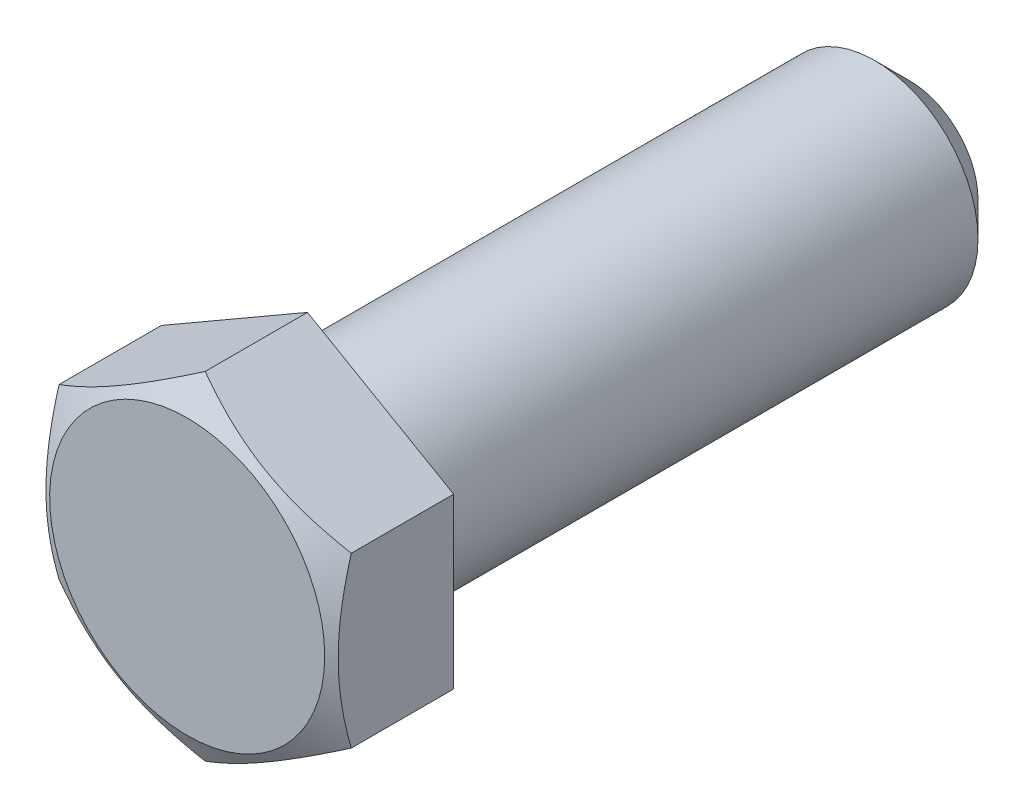
ISO-10303-21;
HEADER;
FILE_DESCRIPTION(('STEP AP214'),'2;1');
FILE_NAME('part.step','',(''),(''),'','','');
FILE_SCHEMA(('AUTOMOTIVE_DESIGN { 1 0 10303 214 1 1 1 1 }'));
ENDSEC;
DATA;
#1=APPLICATION_CONTEXT('core data for automotive mechanical design processes');
#2=APPLICATION_PROTOCOL_DEFINITION('international standard','automotive_design',2000,#1);
#3=PRODUCT_CONTEXT('',#1,'mechanical');
#4=PRODUCT('Part','Part','',(#3));
#5=PRODUCT_RELATED_PRODUCT_CATEGORY('part','',(#4));
#6=PRODUCT_DEFINITION_FORMATION('','',#4);
#7=PRODUCT_DEFINITION_CONTEXT('part definition',#1,'design');
#8=PRODUCT_DEFINITION('design','',#6,#7);
#9=PRODUCT_DEFINITION_SHAPE('','',#8);
#10=(LENGTH_UNIT() NAMED_UNIT(*) SI_UNIT(.MILLI.,.METRE.));
#11=(NAMED_UNIT(*) PLANE_ANGLE_UNIT() SI_UNIT($,.RADIAN.));
#12=(NAMED_UNIT(*) SI_UNIT($,.STERADIAN.) SOLID_ANGLE_UNIT());
#13=UNCERTAINTY_MEASURE_WITH_UNIT(LENGTH_MEASURE(1.E-05),#10,'distance_accuracy_value','');
#14=(GEOMETRIC_REPRESENTATION_CONTEXT(3) GLOBAL_UNCERTAINTY_ASSIGNED_CONTEXT((#13)) GLOBAL_UNIT_ASSIGNED_CONTEXT((#10,
#11,#12)) REPRESENTATION_CONTEXT('',''));
#15=CARTESIAN_POINT('',(0.,0.,0.));
#16=DIRECTION('',(0.,0.,1.));
#17=DIRECTION('',(1.,0.,0.));
#18=AXIS2_PLACEMENT_3D('',#15,#16,#17);
#19=CARTESIAN_POINT('',(0.,0.,-7.));
#20=DIRECTION('',(0.,0.,-1.));
#21=DIRECTION('',(-1.,0.,0.));
#22=AXIS2_PLACEMENT_3D('',#19,#20,#21);
#23=PLANE('',#22);
#24=CARTESIAN_POINT('',(0.,0.,-7.));
#25=DIRECTION('',(0.,0.,-1.));
#26=DIRECTION('',(-1.,0.,0.));
#27=AXIS2_PLACEMENT_3D('',#24,#25,#26);
#28=CIRCLE('',#27,6.6);
#29=CARTESIAN_POINT('',(-6.60000000000002,0.,-7.));
#30=VERTEX_POINT('',#29);
#31=EDGE_CURVE('E189',#30,#30,#28,.F.);
#32=ORIENTED_EDGE('',*,*,#31,.T.);
#33=EDGE_LOOP('',(#32));
#34=FACE_BOUND('',#33,.T.);
#35=DIRECTION('',(-0.866025403784439,-0.499999999999999,0.));
#36=VECTOR('',#35,1.);
#37=CARTESIAN_POINT('',(0.,9.81495457622369,-7.00000000000002));
#38=LINE('',#37,#36);
#39=CARTESIAN_POINT('',(0.,9.81495457622369,-7.00000000000002));
#40=VERTEX_POINT('',#39);
#41=CARTESIAN_POINT('',(-8.50000000000006,4.90747728811186,-7.00000000000001));
#42=VERTEX_POINT('',#41);
#43=EDGE_CURVE('E146',#40,#42,#38,.T.);
#44=ORIENTED_EDGE('',*,*,#43,.F.);
#45=DIRECTION('',(-0.866025403784439,0.5,0.));
#46=VECTOR('',#45,1.);
#47=CARTESIAN_POINT('',(8.49999999999997,4.9074772881118,-7.00000000000001));
#48=LINE('',#47,#46);
#49=CARTESIAN_POINT('',(8.49999999999997,4.9074772881118,-7.00000000000001));
#50=VERTEX_POINT('',#49);
#51=EDGE_CURVE('E87',#50,#40,#48,.T.);
#52=ORIENTED_EDGE('',*,*,#51,.F.);
#53=DIRECTION('',(0.,1.,0.));
#54=VECTOR('',#53,1.);
#55=CARTESIAN_POINT('',(8.50000000000002,-4.90747728811184,-7.));
#56=LINE('',#55,#54);
#57=CARTESIAN_POINT('',(8.50000000000002,-4.90747728811184,-7.));
#58=VERTEX_POINT('',#57);
#59=EDGE_CURVE('E155',#58,#50,#56,.T.);
#60=ORIENTED_EDGE('',*,*,#59,.F.);
#61=DIRECTION('',(0.866025403784439,0.499999999999999,0.));
#62=VECTOR('',#61,1.);
#63=CARTESIAN_POINT('',(0.,-9.81495457622357,-7.00000000000003));
#64=LINE('',#63,#62);
#65=CARTESIAN_POINT('',(0.,-9.81495457622357,-7.00000000000003));
#66=VERTEX_POINT('',#65);
#67=EDGE_CURVE('E150',#66,#58,#64,.T.);
#68=ORIENTED_EDGE('',*,*,#67,.F.);
#69=DIRECTION('',(0.866025403784439,-0.5,0.));
#70=VECTOR('',#69,1.);
#71=CARTESIAN_POINT('',(-8.50000000000004,-4.90747728811183,-7.));
#72=LINE('',#71,#70);
#73=CARTESIAN_POINT('',(-8.50000000000004,-4.90747728811183,-7.));
#74=VERTEX_POINT('',#73);
#75=EDGE_CURVE('E131',#74,#66,#72,.T.);
#76=ORIENTED_EDGE('',*,*,#75,.F.);
#77=DIRECTION('',(0.,-0.999999999999999,0.));
#78=VECTOR('',#77,1.);
#79=CARTESIAN_POINT('',(-8.50000000000006,4.90747728811186,-7.00000000000001));
#80=LINE('',#79,#78);
#81=EDGE_CURVE('E141',#42,#74,#80,.T.);
#82=ORIENTED_EDGE('',*,*,#81,.F.);
#83=EDGE_LOOP('',(#44,#52,#60,#68,#76,#82));
#84=FACE_BOUND('',#83,.T.);
#85=ADVANCED_FACE('F65',(#34,#84),#23,.T.);
#86=CARTESIAN_POINT('',(0.,0.,-42.));
#87=DIRECTION('',(0.,0.,-1.));
#88=DIRECTION('',(-1.,0.,0.));
#89=AXIS2_PLACEMENT_3D('',#86,#87,#88);
#90=PLANE('',#89);
#91=CARTESIAN_POINT('',(0.,0.,-42.));
#92=DIRECTION('',(0.,0.,-1.));
#93=DIRECTION('',(-1.,0.,0.));
#94=AXIS2_PLACEMENT_3D('',#91,#92,#93);
#95=CIRCLE('',#94,3.99999999999999);
#96=CARTESIAN_POINT('',(3.99999999999997,0.,-42.));
#97=VERTEX_POINT('',#96);
#98=EDGE_CURVE('E185',#97,#97,#95,.T.);
#99=ORIENTED_EDGE('',*,*,#98,.T.);
#100=EDGE_LOOP('',(#99));
#101=FACE_BOUND('',#100,.T.);
#102=ADVANCED_FACE('F236',(#101),#90,.T.);
#103=CARTESIAN_POINT('',(0.,0.,0.));
#104=DIRECTION('',(0.,0.,1.));
#105=DIRECTION('',(1.,0.,0.));
#106=AXIS2_PLACEMENT_3D('',#103,#104,#105);
#107=CYLINDRICAL_SURFACE('',#106,6.);
#108=CARTESIAN_POINT('',(0.,0.,-7.6));
#109=DIRECTION('',(0.,0.,-1.));
#110=DIRECTION('',(-1.,0.,0.));
#111=AXIS2_PLACEMENT_3D('',#108,#109,#110);
#112=CIRCLE('',#111,6.);
#113=CARTESIAN_POINT('',(6.00000000000001,0.,-7.6));
#114=VERTEX_POINT('',#113);
#115=EDGE_CURVE('E193',#114,#114,#112,.T.);
#116=CARTESIAN_POINT('',(0.,0.,-40.));
#117=DIRECTION('',(0.,0.,-1.));
#118=DIRECTION('',(-1.,0.,0.));
#119=AXIS2_PLACEMENT_3D('',#116,#117,#118);
#120=CIRCLE('',#119,6.);
#121=CARTESIAN_POINT('',(6.00000000000001,0.,-40.));
#122=VERTEX_POINT('',#121);
#123=EDGE_CURVE('E181',#122,#122,#120,.F.);
#124=CARTESIAN_POINT('',(6.00000000000001,0.,-7.6));
#125=CARTESIAN_POINT('',(6.00000000000001,0.,-7.9375));
#126=CARTESIAN_POINT('',(6.00000000000001,0.,-8.275));
#127=CARTESIAN_POINT('',(6.00000000000001,0.,-8.95));
#128=CARTESIAN_POINT('',(6.00000000000001,0.,-9.2875));
#129=CARTESIAN_POINT('',(6.00000000000001,0.,-9.9625));
#130=CARTESIAN_POINT('',(6.00000000000001,0.,-10.3));
#131=CARTESIAN_POINT('',(6.00000000000001,0.,-10.975));
#132=CARTESIAN_POINT('',(6.00000000000001,0.,-11.3125));
#133=CARTESIAN_POINT('',(6.00000000000001,0.,-11.9875));
#134=CARTESIAN_POINT('',(6.00000000000001,0.,-12.325));
#135=CARTESIAN_POINT('',(6.00000000000001,0.,-13.));
#136=CARTESIAN_POINT('',(6.00000000000001,0.,-13.3375));
#137=CARTESIAN_POINT('',(6.00000000000001,0.,-14.0125));
#138=CARTESIAN_POINT('',(6.00000000000001,0.,-14.35));
#139=CARTESIAN_POINT('',(6.00000000000001,0.,-15.025));
#140=CARTESIAN_POINT('',(6.00000000000001,0.,-15.3625));
#141=CARTESIAN_POINT('',(6.00000000000001,0.,-16.0375));
#142=CARTESIAN_POINT('',(6.00000000000001,0.,-16.375));
#143=CARTESIAN_POINT('',(6.00000000000001,0.,-17.05));
#144=CARTESIAN_POINT('',(6.00000000000001,0.,-17.3875));
#145=CARTESIAN_POINT('',(6.00000000000001,0.,-18.0625));
#146=CARTESIAN_POINT('',(6.00000000000001,0.,-18.4));
#147=CARTESIAN_POINT('',(6.00000000000001,0.,-19.075));
#148=CARTESIAN_POINT('',(6.00000000000001,0.,-19.4125));
#149=CARTESIAN_POINT('',(6.00000000000001,0.,-20.0875));
#150=CARTESIAN_POINT('',(6.00000000000001,0.,-20.425));
#151=CARTESIAN_POINT('',(6.00000000000001,0.,-21.1));
#152=CARTESIAN_POINT('',(6.00000000000001,0.,-21.4375));
#153=CARTESIAN_POINT('',(6.00000000000001,0.,-22.1125));
#154=CARTESIAN_POINT('',(6.00000000000001,0.,-22.45));
#155=CARTESIAN_POINT('',(6.00000000000001,0.,-23.125));
#156=CARTESIAN_POINT('',(6.00000000000001,0.,-23.4625));
#157=CARTESIAN_POINT('',(6.00000000000001,0.,-24.1375));
#158=CARTESIAN_POINT('',(6.00000000000001,0.,-24.475));
#159=CARTESIAN_POINT('',(6.00000000000001,0.,-25.15));
#160=CARTESIAN_POINT('',(6.00000000000001,0.,-25.4875));
#161=CARTESIAN_POINT('',(6.00000000000001,0.,-26.1625));
#162=CARTESIAN_POINT('',(6.00000000000001,0.,-26.5));
#163=CARTESIAN_POINT('',(6.00000000000001,0.,-27.175));
#164=CARTESIAN_POINT('',(6.00000000000001,0.,-27.5125));
#165=CARTESIAN_POINT('',(6.00000000000001,0.,-28.1875));
#166=CARTESIAN_POINT('',(6.00000000000001,0.,-28.525));
#167=CARTESIAN_POINT('',(6.00000000000001,0.,-29.2));
#168=CARTESIAN_POINT('',(6.00000000000001,0.,-29.5375));
#169=CARTESIAN_POINT('',(6.00000000000001,0.,-30.2125));
#170=CARTESIAN_POINT('',(6.00000000000001,0.,-30.55));
#171=CARTESIAN_POINT('',(6.00000000000001,0.,-31.225));
#172=CARTESIAN_POINT('',(6.00000000000001,0.,-31.5625));
#173=CARTESIAN_POINT('',(6.00000000000001,0.,-32.2375));
#174=CARTESIAN_POINT('',(6.00000000000001,0.,-32.575));
#175=CARTESIAN_POINT('',(6.00000000000001,0.,-33.25));
#176=CARTESIAN_POINT('',(6.00000000000001,0.,-33.5875));
#177=CARTESIAN_POINT('',(6.00000000000001,0.,-34.2625));
#178=CARTESIAN_POINT('',(6.00000000000001,0.,-34.6));
#179=CARTESIAN_POINT('',(6.00000000000001,0.,-35.275));
#180=CARTESIAN_POINT('',(6.00000000000001,0.,-35.6125));
#181=CARTESIAN_POINT('',(6.00000000000001,0.,-36.2875));
#182=CARTESIAN_POINT('',(6.00000000000001,0.,-36.625));
#183=CARTESIAN_POINT('',(6.00000000000001,0.,-37.3));
#184=CARTESIAN_POINT('',(6.00000000000001,0.,-37.6375));
#185=CARTESIAN_POINT('',(6.00000000000001,0.,-38.3125));
#186=CARTESIAN_POINT('',(6.00000000000001,0.,-38.65));
#187=CARTESIAN_POINT('',(6.00000000000001,0.,-39.325));
#188=CARTESIAN_POINT('',(6.00000000000001,0.,-39.6625));
#189=CARTESIAN_POINT('',(6.00000000000001,0.,-40.));
#190=B_SPLINE_CURVE_WITH_KNOTS('',3,(#124,#125,#126,#127,#128,#129,#130,#131,#132,#133,#134,
#135,#136,#137,#138,#139,#140,#141,#142,#143,#144,#145,#146,#147,#148,#149,#150,#151,#152,#153,
#154,#155,#156,#157,#158,#159,#160,#161,#162,#163,#164,#165,#166,#167,#168,#169,#170,#171,#172,
#173,#174,#175,#176,#177,#178,#179,#180,#181,#182,#183,#184,#185,#186,#187,#188,#189),
.UNSPECIFIED.,.F.,.F.,(4,2,2,2,2,2,2,2,2,2,2,2,2,2,2,2,2,2,2,2,2,2,2,2,2,2,2,2,2,2,2,2,4),(0.,
1.0125,2.025,3.0375,4.05,5.0625,6.075,7.0875,8.1,9.1125,10.125,11.1375,12.15,13.1625,14.175,
15.1875,16.2,17.2125,18.225,19.2375,20.25,21.2625,22.275,23.2875,24.3,25.3125,26.325,27.3375,
28.35,29.3625,30.375,31.3875,32.4),.UNSPECIFIED.);
#191=EDGE_CURVE('BSEAM241',#114,#122,#190,.T.);
#192=ORIENTED_EDGE('',*,*,#115,.T.);
#193=ORIENTED_EDGE('',*,*,#123,.T.);
#194=ORIENTED_EDGE('',*,*,#191,.T.);
#195=ORIENTED_EDGE('',*,*,#191,.F.);
#196=EDGE_LOOP('',(#192,#194,#193,#195));
#197=FACE_BOUND('',#196,.T.);
#198=ADVANCED_FACE('F241',(#197),#107,.T.);
#199=CARTESIAN_POINT('',(0.,0.,-40.));
#200=DIRECTION('',(0.,0.,1.));
#201=DIRECTION('',(1.,0.,0.));
#202=AXIS2_PLACEMENT_3D('',#199,#200,#201);
#203=CONICAL_SURFACE('',#202,6.,0.78539816339745);
#204=CARTESIAN_POINT('',(3.99999999999997,0.,-42.));
#205=CARTESIAN_POINT('',(4.0208333333333,0.,-41.9791666666667));
#206=CARTESIAN_POINT('',(4.04166666666664,0.,-41.9583333333333));
#207=CARTESIAN_POINT('',(4.0833333333333,0.,-41.9166666666667));
#208=CARTESIAN_POINT('',(4.10416666666664,0.,-41.8958333333333));
#209=CARTESIAN_POINT('',(4.1458333333333,0.,-41.8541666666667));
#210=CARTESIAN_POINT('',(4.16666666666664,0.,-41.8333333333333));
#211=CARTESIAN_POINT('',(4.2083333333333,0.,-41.7916666666667));
#212=CARTESIAN_POINT('',(4.22916666666664,0.,-41.7708333333333));
#213=CARTESIAN_POINT('',(4.2708333333333,0.,-41.7291666666667));
#214=CARTESIAN_POINT('',(4.29166666666664,0.,-41.7083333333333));
#215=CARTESIAN_POINT('',(4.33333333333331,0.,-41.6666666666667));
#216=CARTESIAN_POINT('',(4.35416666666664,0.,-41.6458333333333));
#217=CARTESIAN_POINT('',(4.39583333333331,0.,-41.6041666666667));
#218=CARTESIAN_POINT('',(4.41666666666664,0.,-41.5833333333333));
#219=CARTESIAN_POINT('',(4.45833333333331,0.,-41.5416666666667));
#220=CARTESIAN_POINT('',(4.47916666666664,0.,-41.5208333333333));
#221=CARTESIAN_POINT('',(4.52083333333331,0.,-41.4791666666667));
#222=CARTESIAN_POINT('',(4.54166666666664,0.,-41.4583333333333));
#223=CARTESIAN_POINT('',(4.58333333333331,0.,-41.4166666666667));
#224=CARTESIAN_POINT('',(4.60416666666664,0.,-41.3958333333333));
#225=CARTESIAN_POINT('',(4.64583333333331,0.,-41.3541666666667));
#226=CARTESIAN_POINT('',(4.66666666666664,0.,-41.3333333333333));
#227=CARTESIAN_POINT('',(4.70833333333331,0.,-41.2916666666667));
#228=CARTESIAN_POINT('',(4.72916666666664,0.,-41.2708333333333));
#229=CARTESIAN_POINT('',(4.77083333333331,0.,-41.2291666666667));
#230=CARTESIAN_POINT('',(4.79166666666664,0.,-41.2083333333333));
#231=CARTESIAN_POINT('',(4.83333333333331,0.,-41.1666666666667));
#232=CARTESIAN_POINT('',(4.85416666666664,0.,-41.1458333333333));
#233=CARTESIAN_POINT('',(4.89583333333331,0.,-41.1041666666667));
#234=CARTESIAN_POINT('',(4.91666666666664,0.,-41.0833333333333));
#235=CARTESIAN_POINT('',(4.95833333333331,0.,-41.0416666666667));
#236=CARTESIAN_POINT('',(4.97916666666664,0.,-41.0208333333333));
#237=CARTESIAN_POINT('',(5.02083333333331,0.,-40.9791666666667));
#238=CARTESIAN_POINT('',(5.04166666666664,0.,-40.9583333333333));
#239=CARTESIAN_POINT('',(5.08333333333331,0.,-40.9166666666667));
#240=CARTESIAN_POINT('',(5.10416666666664,0.,-40.8958333333333));
#241=CARTESIAN_POINT('',(5.14583333333331,0.,-40.8541666666667));
#242=CARTESIAN_POINT('',(5.16666666666664,0.,-40.8333333333333));
#243=CARTESIAN_POINT('',(5.20833333333331,0.,-40.7916666666667));
#244=CARTESIAN_POINT('',(5.22916666666665,0.,-40.7708333333333));
#245=CARTESIAN_POINT('',(5.27083333333331,0.,-40.7291666666667));
#246=CARTESIAN_POINT('',(5.29166666666664,0.,-40.7083333333333));
#247=CARTESIAN_POINT('',(5.33333333333331,0.,-40.6666666666667));
#248=CARTESIAN_POINT('',(5.35416666666665,0.,-40.6458333333333));
#249=CARTESIAN_POINT('',(5.39583333333331,0.,-40.6041666666667));
#250=CARTESIAN_POINT('',(5.41666666666664,0.,-40.5833333333333));
#251=CARTESIAN_POINT('',(5.45833333333331,0.,-40.5416666666667));
#252=CARTESIAN_POINT('',(5.47916666666665,0.,-40.5208333333333));
#253=CARTESIAN_POINT('',(5.52083333333331,0.,-40.4791666666667));
#254=CARTESIAN_POINT('',(5.54166666666665,0.,-40.4583333333333));
#255=CARTESIAN_POINT('',(5.58333333333331,0.,-40.4166666666667));
#256=CARTESIAN_POINT('',(5.60416666666665,0.,-40.3958333333333));
#257=CARTESIAN_POINT('',(5.64583333333331,0.,-40.3541666666667));
#258=CARTESIAN_POINT('',(5.66666666666665,0.,-40.3333333333333));
#259=CARTESIAN_POINT('',(5.70833333333331,0.,-40.2916666666667));
#260=CARTESIAN_POINT('',(5.72916666666665,0.,-40.2708333333333));
#261=CARTESIAN_POINT('',(5.77083333333331,0.,-40.2291666666667));
#262=CARTESIAN_POINT('',(5.79166666666665,0.,-40.2083333333333));
#263=CARTESIAN_POINT('',(5.83333333333331,0.,-40.1666666666667));
#264=CARTESIAN_POINT('',(5.85416666666665,0.,-40.1458333333333));
#265=CARTESIAN_POINT('',(5.89583333333332,0.,-40.1041666666667));
#266=CARTESIAN_POINT('',(5.91666666666665,0.,-40.0833333333333));
#267=CARTESIAN_POINT('',(5.95833333333332,0.,-40.0416666666667));
#268=CARTESIAN_POINT('',(5.97916666666665,0.,-40.0208333333333));
#269=CARTESIAN_POINT('',(5.99999999999998,0.,-40.));
#270=B_SPLINE_CURVE_WITH_KNOTS('',3,(#204,#205,#206,#207,#208,#209,#210,#211,#212,#213,#214,
#215,#216,#217,#218,#219,#220,#221,#222,#223,#224,#225,#226,#227,#228,#229,#230,#231,#232,#233,
#234,#235,#236,#237,#238,#239,#240,#241,#242,#243,#244,#245,#246,#247,#248,#249,#250,#251,#252,
#253,#254,#255,#256,#257,#258,#259,#260,#261,#262,#263,#264,#265,#266,#267,#268,#269),
.UNSPECIFIED.,.F.,.F.,(4,2,2,2,2,2,2,2,2,2,2,2,2,2,2,2,2,2,2,2,2,2,2,2,2,2,2,2,2,2,2,2,4),(0.,
0.0883883476483185,0.176776695296637,0.265165042944956,0.353553390593274,0.441941738241594,
0.530330085889912,0.618718433538231,0.70710678118655,0.795495128834869,0.883883476483187,
0.972271824131511,1.06066017177983,1.14904851942815,1.23743686707646,1.32582521472479,
1.4142135623731,1.50260191002142,1.59099025766974,1.67937860531806,1.76776695296638,
1.8561553006147,1.94454364826301,2.03293199591134,2.12132034355965,2.20970869120797,
2.29809703885629,2.38648538650461,2.47487373415293,2.56326208180125,2.65165042944957,
2.74003877709789,2.8284271247462),.UNSPECIFIED.);
#271=EDGE_CURVE('BSEAM233',#97,#122,#270,.T.);
#272=ORIENTED_EDGE('',*,*,#98,.F.);
#273=ORIENTED_EDGE('',*,*,#123,.F.);
#274=ORIENTED_EDGE('',*,*,#271,.T.);
#275=ORIENTED_EDGE('',*,*,#271,.F.);
#276=EDGE_LOOP('',(#272,#274,#273,#275));
#277=FACE_BOUND('',#276,.T.);
#278=ADVANCED_FACE('F233',(#277),#203,.T.);
#279=CARTESIAN_POINT('',(0.,0.,-7.6));
#280=DIRECTION('',(0.,0.,-1.));
#281=DIRECTION('',(-1.,0.,0.));
#282=AXIS2_PLACEMENT_3D('',#279,#280,#281);
#283=TOROIDAL_SURFACE('',#282,6.6,0.6);
#284=ORIENTED_EDGE('',*,*,#115,.F.);
#285=EDGE_LOOP('',(#284));
#286=FACE_BOUND('',#285,.T.);
#287=ORIENTED_EDGE('',*,*,#31,.F.);
#288=EDGE_LOOP('',(#287));
#289=FACE_BOUND('',#288,.T.);
#290=ADVANCED_FACE('F67',(#286,#289),#283,.F.);
#291=CARTESIAN_POINT('',(8.49999999999997,4.9074772881118,-7.00000000000001));
#292=DIRECTION('',(0.5,0.866025403784438,0.));
#293=DIRECTION('',(-0.866025403784439,0.5,0.));
#294=AXIS2_PLACEMENT_3D('',#291,#292,#293);
#295=PLANE('',#294);
#296=DIRECTION('',(0.,0.,1.));
#297=VECTOR('',#296,1.);
#298=CARTESIAN_POINT('',(8.49999999999997,4.9074772881118,-7.00000000000001));
#299=LINE('',#298,#297);
#300=CARTESIAN_POINT('',(8.49999999999998,4.9074772881118,-1.04786451314967));
#301=VERTEX_POINT('',#300);
#302=EDGE_CURVE('E163',#50,#301,#299,.T.);
#303=ORIENTED_EDGE('',*,*,#302,.F.);
#304=ORIENTED_EDGE('',*,*,#51,.T.);
#305=DIRECTION('',(0.,0.,1.));
#306=VECTOR('',#305,1.);
#307=CARTESIAN_POINT('',(0.,9.81495457622369,-7.00000000000002));
#308=LINE('',#307,#306);
#309=CARTESIAN_POINT('',(0.,9.81495457622363,-1.04786451314971));
#310=VERTEX_POINT('',#309);
#311=EDGE_CURVE('E162',#40,#310,#308,.T.);
#312=ORIENTED_EDGE('',*,*,#311,.T.);
#313=CARTESIAN_POINT('',(8.50020000000001,4.90736181805798,-1.04793118099279));
#314=CARTESIAN_POINT('',(8.31336077237731,5.0152334964211,-0.985661273843733));
#315=CARTESIAN_POINT('',(8.1258249420654,5.12350735853437,-0.926217430342142));
#316=CARTESIAN_POINT('',(7.74923024542823,5.34093440801322,-0.813760245355053));
#317=CARTESIAN_POINT('',(7.56017075895663,5.45008795342045,-0.760749679577884));
#318=CARTESIAN_POINT('',(6.9899652414386,5.7792962624529,-0.612408524325255));
#319=CARTESIAN_POINT('',(6.60656835850853,6.00065055601904,-0.528034062532583));
#320=CARTESIAN_POINT('',(6.03282233512584,6.33190297706551,-0.42909515028955));
#321=CARTESIAN_POINT('',(5.84418723571482,6.44081150248908,-0.400910334042992));
#322=CARTESIAN_POINT('',(5.46606397867089,6.65912106673025,-0.353649219360996));
#323=CARTESIAN_POINT('',(5.27657589790346,6.76852206116955,-0.334572116147756));
#324=CARTESIAN_POINT('',(4.8972734724018,6.98751241863721,-0.306009907260598));
#325=CARTESIAN_POINT('',(4.70745974391771,7.09710142587338,-0.296513916066125));
#326=CARTESIAN_POINT('',(4.32765694543932,7.31638067381386,-0.287317514233849));
#327=CARTESIAN_POINT('',(4.13766788104355,7.42607091128586,-0.28761680096206));
#328=CARTESIAN_POINT('',(3.78247698881907,7.63114046852536,-0.297329610168304));
#329=CARTESIAN_POINT('',(3.61725009478621,7.72653426027259,-0.305558303192354));
#330=CARTESIAN_POINT('',(3.28718328645605,7.91709842091256,-0.329264375651699));
#331=CARTESIAN_POINT('',(3.12234339899756,8.01226877430991,-0.344742243713596));
#332=CARTESIAN_POINT('',(2.62846189929869,8.29741139110883,-0.401683755453437));
#333=CARTESIAN_POINT('',(2.30029449767179,8.48687892877738,-0.453648195872406));
#334=CARTESIAN_POINT('',(1.64047857245564,8.86782383081653,-0.583560075117739));
#335=CARTESIAN_POINT('',(1.30891425770531,9.0592525771913,-0.662058204466831));
#336=CARTESIAN_POINT('',(0.650730106539527,9.43925537404322,-0.840216474567432));
#337=CARTESIAN_POINT('',(0.324101841568915,9.62783429074895,-0.939834770724795));
#338=CARTESIAN_POINT('',(-0.000199999999991873,9.81507004627747,-1.04793118099283));
#339=B_SPLINE_CURVE_WITH_KNOTS('',3,(#313,#314,#315,#316,#317,#318,#319,#320,#321,#322,#323,
#324,#325,#326,#327,#328,#329,#330,#331,#332,#333,#334,#335,#336,#337,#338),.UNSPECIFIED.,.F.,
.F.,(4,2,2,2,2,2,2,2,2,2,2,2,4),(0.,0.673596396411509,1.34748239783842,2.69805431639326,
3.356799954547,4.01548737369113,4.67342558367775,5.33134346608655,5.90409556798839,
6.47688628148363,7.62328361419565,8.79510569878587,9.96462743748732),.UNSPECIFIED.);
#340=EDGE_CURVE('E14',#301,#310,#339,.T.);
#341=ORIENTED_EDGE('',*,*,#340,.F.);
#342=EDGE_LOOP('',(#303,#304,#312,#341));
#343=FACE_BOUND('',#342,.T.);
#344=ADVANCED_FACE('F222',(#343),#295,.T.);
#345=CARTESIAN_POINT('',(8.50000000000002,-4.90747728811184,-7.));
#346=DIRECTION('',(1.,0.,0.));
#347=DIRECTION('',(0.,1.,0.));
#348=AXIS2_PLACEMENT_3D('',#345,#346,#347);
#349=PLANE('',#348);
#350=DIRECTION('',(0.,0.,1.));
#351=VECTOR('',#350,1.);
#352=CARTESIAN_POINT('',(8.50000000000002,-4.90747728811184,-7.));
#353=LINE('',#352,#351);
#354=CARTESIAN_POINT('',(8.50000000000004,-4.90747728811185,-1.04786451314966));
#355=VERTEX_POINT('',#354);
#356=EDGE_CURVE('E168',#58,#355,#353,.T.);
#357=ORIENTED_EDGE('',*,*,#356,.F.);
#358=ORIENTED_EDGE('',*,*,#59,.T.);
#359=ORIENTED_EDGE('',*,*,#302,.T.);
#360=CARTESIAN_POINT('',(8.50000000000001,-14.7903220083609,-5.23011699379737));
#361=CARTESIAN_POINT('',(8.50000000000001,-14.4365513934755,-5.0530564033949));
#362=CARTESIAN_POINT('',(8.50000000000002,-14.0821655296815,-4.87721220896523));
#363=CARTESIAN_POINT('',(8.50000000000002,-13.3718826355327,-4.52854477419094));
#364=CARTESIAN_POINT('',(8.50000000000002,-13.0159855064168,-4.35572173517578));
#365=CARTESIAN_POINT('',(8.50000000000002,-12.3017302006186,-4.0133651935272));
#366=CARTESIAN_POINT('',(8.50000000000002,-11.9433685179548,-3.84383899002056));
#367=CARTESIAN_POINT('',(8.50000000000002,-11.2245714013687,-3.50925128459551));
#368=CARTESIAN_POINT('',(8.50000000000002,-10.8641360080447,-3.34418969562894));
#369=CARTESIAN_POINT('',(8.50000000000002,-10.1244692648734,-3.01223736197532));
#370=CARTESIAN_POINT('',(8.50000000000002,-9.7451237374825,-2.84560023135016));
#371=CARTESIAN_POINT('',(8.50000000000002,-8.98317453476667,-2.5198676974024));
#372=CARTESIAN_POINT('',(8.50000000000002,-8.60057071496928,-2.36077263057002));
#373=CARTESIAN_POINT('',(8.50000000000002,-7.83173341756799,-2.05227163186257));
#374=CARTESIAN_POINT('',(8.50000000000002,-7.44550233697594,-1.90285975491816));
#375=CARTESIAN_POINT('',(8.50000000000003,-6.6685176377879,-1.61630616482584));
#376=CARTESIAN_POINT('',(8.50000000000004,-6.27776451902686,-1.47916310992357));
#377=CARTESIAN_POINT('',(8.50000000000003,-5.64190557527386,-1.27021177213892));
#378=CARTESIAN_POINT('',(8.50000000000002,-5.39841030930471,-1.19351685782768));
#379=CARTESIAN_POINT('',(8.50000000000002,-4.90933281191907,-1.04711284927067));
#380=CARTESIAN_POINT('',(8.50000000000002,-4.66375050197177,-0.977404019169492));
#381=CARTESIAN_POINT('',(8.50000000000002,-3.92371817954857,-0.780397937811251));
#382=CARTESIAN_POINT('',(8.50000000000002,-3.42588230630241,-0.665187162805888));
#383=CARTESIAN_POINT('',(8.50000000000002,-2.67752802495171,-0.524631975122393));
#384=CARTESIAN_POINT('',(8.50000000000002,-2.42994937190506,-0.483378101310763));
#385=CARTESIAN_POINT('',(8.50000000000002,-1.93316142891899,-0.412077936535262));
#386=CARTESIAN_POINT('',(8.50000000000002,-1.6839521674662,-0.382031450308099));
#387=CARTESIAN_POINT('',(8.50000000000002,-1.18445143727879,-0.33405265772496));
#388=CARTESIAN_POINT('',(8.50000000000003,-0.93416038496851,-0.316116046611559));
#389=CARTESIAN_POINT('',(8.50000000000001,-0.432985832459559,-0.292921862184339));
#390=CARTESIAN_POINT('',(8.49999999999999,-0.182102334885299,-0.287664232810299));
#391=CARTESIAN_POINT('',(8.49999999999999,0.321144198137039,-0.290014276225472));
#392=CARTESIAN_POINT('',(8.50000000000001,0.573506863387611,-0.297701110718462));
#393=CARTESIAN_POINT('',(8.50000000000003,1.07751320891226,-0.325828176295242));
#394=CARTESIAN_POINT('',(8.50000000000002,1.32915688598887,-0.346268464007569));
#395=CARTESIAN_POINT('',(8.50000000000002,1.83125411197957,-0.399249613309962));
#396=CARTESIAN_POINT('',(8.50000000000002,2.08170717419135,-0.431795053682497));
#397=CARTESIAN_POINT('',(8.50000000000002,2.58089464238304,-0.508024276885823));
#398=CARTESIAN_POINT('',(8.50000000000002,2.82962898796705,-0.55170844910907));
#399=CARTESIAN_POINT('',(8.50000000000002,3.58127054910839,-0.699436995312072));
#400=CARTESIAN_POINT('',(8.50000000000002,4.08113363773556,-0.819197486387527));
#401=CARTESIAN_POINT('',(8.50000000000002,4.82427987514117,-1.02259315412123));
#402=CARTESIAN_POINT('',(8.50000000000002,5.07097043894869,-1.09437947951078));
#403=CARTESIAN_POINT('',(8.50000000000002,5.56225979181315,-1.24479735989363));
#404=CARTESIAN_POINT('',(8.50000000000003,5.80685865977744,-1.32342865540439));
#405=CARTESIAN_POINT('',(8.50000000000004,6.43597906642992,-1.53405682269815));
#406=CARTESIAN_POINT('',(8.50000000000003,6.81902026292838,-1.67046132712514));
#407=CARTESIAN_POINT('',(8.50000000000002,7.58068239887695,-1.95468985994072));
#408=CARTESIAN_POINT('',(8.50000000000002,7.95930452619653,-2.10251073418689));
#409=CARTESIAN_POINT('',(8.50000000000002,8.71314966415636,-2.40725717703678));
#410=CARTESIAN_POINT('',(8.50000000000002,9.08837018850504,-2.56418886806483));
#411=CARTESIAN_POINT('',(8.50000000000002,9.83575935958732,-2.88519289144241));
#412=CARTESIAN_POINT('',(8.50000000000002,10.2079278157102,-3.049265665798));
#413=CARTESIAN_POINT('',(8.50000000000002,10.9339111302063,-3.37600815171214));
#414=CARTESIAN_POINT('',(8.50000000000002,11.2878331303596,-3.53844051707849));
#415=CARTESIAN_POINT('',(8.50000000000002,11.993681947575,-3.86756199974161));
#416=CARTESIAN_POINT('',(8.50000000000002,12.3456087955753,-4.03425105080952));
#417=CARTESIAN_POINT('',(8.50000000000002,13.0471507467618,-4.37082241835337));
#418=CARTESIAN_POINT('',(8.50000000000002,13.3967688683012,-4.54069845610899));
#419=CARTESIAN_POINT('',(8.50000000000002,14.0945634699861,-4.88336341561508));
#420=CARTESIAN_POINT('',(8.50000000000002,14.4427399903719,-5.05615225536697));
#421=CARTESIAN_POINT('',(8.50000000000001,14.7903220083608,-5.23011699379738));
#422=B_SPLINE_CURVE_WITH_KNOTS('',3,(#360,#361,#362,#363,#364,#365,#366,#367,#368,#369,#370,
#371,#372,#373,#374,#375,#376,#377,#378,#379,#380,#381,#382,#383,#384,#385,#386,#387,#388,#389,
#390,#391,#392,#393,#394,#395,#396,#397,#398,#399,#400,#401,#402,#403,#404,#405,#406,#407,#408,
#409,#410,#411,#412,#413,#414,#415,#416,#417,#418,#419,#420,#421),.UNSPECIFIED.,.F.,.F.,(4,2,2,
2,2,2,2,2,2,2,2,2,2,2,2,2,2,2,2,2,2,2,2,2,2,2,2,2,2,2,4),(0.,1.18682422744318,2.37372724551842,
3.56301264243073,4.75227483469075,5.99520662171131,7.23819381021614,8.48041048261725,
9.72249113605598,10.4882551780599,11.2540481627672,12.7853164632775,13.53808773865,
14.290845898079,15.0433363297412,15.7958234342547,16.5529290949689,17.3100381174465,
18.0674338086562,18.8248559808528,20.3652286475369,21.1359422504953,21.9066266495702,
23.1261888658036,24.3454153355645,25.5654708224311,26.7856019338152,27.9538172099787,
29.1220143211916,30.2881115203607,31.454175947246),.UNSPECIFIED.);
#423=EDGE_CURVE('E80',#355,#301,#422,.T.);
#424=ORIENTED_EDGE('',*,*,#423,.F.);
#425=EDGE_LOOP('',(#357,#358,#359,#424));
#426=FACE_BOUND('',#425,.T.);
#427=ADVANCED_FACE('F225',(#426),#349,.T.);
#428=CARTESIAN_POINT('',(0.,-9.81495457622357,-7.00000000000003));
#429=DIRECTION('',(0.499999999999999,-0.866025403784439,0.));
#430=DIRECTION('',(0.866025403784439,0.499999999999999,0.));
#431=AXIS2_PLACEMENT_3D('',#428,#429,#430);
#432=PLANE('',#431);
#433=DIRECTION('',(0.,0.,1.));
#434=VECTOR('',#433,1.);
#435=CARTESIAN_POINT('',(0.,-9.81495457622357,-7.00000000000003));
#436=LINE('',#435,#434);
#437=CARTESIAN_POINT('',(0.,-9.81495457622361,-1.04786451314964));
#438=VERTEX_POINT('',#437);
#439=EDGE_CURVE('E138',#66,#438,#436,.T.);
#440=ORIENTED_EDGE('',*,*,#439,.F.);
#441=ORIENTED_EDGE('',*,*,#67,.T.);
#442=ORIENTED_EDGE('',*,*,#356,.T.);
#443=CARTESIAN_POINT('',(-0.000199999999991873,-9.81507004627748,-1.04793118099276));
#444=CARTESIAN_POINT('',(0.186639227622676,-9.7071983679143,-0.985661273843708));
#445=CARTESIAN_POINT('',(0.374175057934572,-9.598924505801,-0.926217430342118));
#446=CARTESIAN_POINT('',(0.750769754571732,-9.38149745632213,-0.813760245355031));
#447=CARTESIAN_POINT('',(0.939829241043339,-9.27234391091491,-0.760749679577861));
#448=CARTESIAN_POINT('',(1.51003475856138,-8.94313560188247,-0.612408524325233));
#449=CARTESIAN_POINT('',(1.89343164149144,-8.72178130831633,-0.52803406253256));
#450=CARTESIAN_POINT('',(2.46717766487413,-8.39052888726985,-0.429095150289527));
#451=CARTESIAN_POINT('',(2.65581276428516,-8.28162036184628,-0.400910334042969));
#452=CARTESIAN_POINT('',(3.03393602132909,-8.06331079760511,-0.353649219360975));
#453=CARTESIAN_POINT('',(3.22342410209652,-7.95390980316581,-0.334572116147736));
#454=CARTESIAN_POINT('',(3.60272652759818,-7.73491944569815,-0.306009907260577));
#455=CARTESIAN_POINT('',(3.79254025608226,-7.62533043846196,-0.296513916066102));
#456=CARTESIAN_POINT('',(4.17234305456067,-7.40605119052151,-0.287317514233832));
#457=CARTESIAN_POINT('',(4.36233211895648,-7.29636095304955,-0.287616800962053));
#458=CARTESIAN_POINT('',(4.71752301118095,-7.09129139581004,-0.297329610168297));
#459=CARTESIAN_POINT('',(4.88274990521379,-6.99589760406278,-0.30555830319234));
#460=CARTESIAN_POINT('',(5.21281671354393,-6.80533344342278,-0.32926437565168));
#461=CARTESIAN_POINT('',(5.37765660100242,-6.71016309002545,-0.34474224371358));
#462=CARTESIAN_POINT('',(5.8715381007013,-6.42502047322654,-0.401683755453424));
#463=CARTESIAN_POINT('',(6.19970550232819,-6.23555293555799,-0.453648195872392));
#464=CARTESIAN_POINT('',(6.85952142754433,-5.85460803351884,-0.583560075117725));
#465=CARTESIAN_POINT('',(7.19108574229465,-5.66317928714406,-0.662058204466818));
#466=CARTESIAN_POINT('',(7.84926989346044,-5.28317649029217,-0.840216474567415));
#467=CARTESIAN_POINT('',(8.17589815843106,-5.09459757358646,-0.939834770724771));
#468=CARTESIAN_POINT('',(8.5002,-4.90736181805798,-1.04793118099279));
#469=B_SPLINE_CURVE_WITH_KNOTS('',3,(#443,#444,#445,#446,#447,#448,#449,#450,#451,#452,#453,
#454,#455,#456,#457,#458,#459,#460,#461,#462,#463,#464,#465,#466,#467,#468),.UNSPECIFIED.,.F.,
.F.,(4,2,2,2,2,2,2,2,2,2,2,2,4),(0.,0.673596396411511,1.34748239783842,2.69805431639327,
3.35679995454701,4.01548737369114,4.67342558367777,5.33134346608657,5.90409556798841,
6.47688628148365,7.62328361419565,8.79510569878586,9.96462743748731),.UNSPECIFIED.);
#470=EDGE_CURVE('E368',#438,#355,#469,.T.);
#471=ORIENTED_EDGE('',*,*,#470,.F.);
#472=EDGE_LOOP('',(#440,#441,#442,#471));
#473=FACE_BOUND('',#472,.T.);
#474=ADVANCED_FACE('F230',(#473),#432,.T.);
#475=CARTESIAN_POINT('',(-8.50000000000004,-4.90747728811183,-7.));
#476=DIRECTION('',(-0.5,-0.866025403784438,0.));
#477=DIRECTION('',(0.866025403784439,-0.5,0.));
#478=AXIS2_PLACEMENT_3D('',#475,#476,#477);
#479=PLANE('',#478);
#480=DIRECTION('',(0.,0.,1.));
#481=VECTOR('',#480,1.);
#482=CARTESIAN_POINT('',(-8.50000000000004,-4.90747728811183,-7.));
#483=LINE('',#482,#481);
#484=CARTESIAN_POINT('',(-8.49999999999997,-4.90747728811185,-1.04786451314966));
#485=VERTEX_POINT('',#484);
#486=EDGE_CURVE('E126',#74,#485,#483,.T.);
#487=ORIENTED_EDGE('',*,*,#486,.F.);
#488=ORIENTED_EDGE('',*,*,#75,.T.);
#489=ORIENTED_EDGE('',*,*,#439,.T.);
#490=CARTESIAN_POINT('',(-8.50019999999996,-4.90736181805801,-1.04793118099279));
#491=CARTESIAN_POINT('',(-8.31336077237728,-5.01523349642117,-0.985661273843739));
#492=CARTESIAN_POINT('',(-8.12582494206537,-5.12350735853445,-0.926217430342154));
#493=CARTESIAN_POINT('',(-7.74923024542821,-5.34093440801331,-0.813760245355072));
#494=CARTESIAN_POINT('',(-7.56017075895661,-5.45008795342054,-0.760749679577903));
#495=CARTESIAN_POINT('',(-6.98996524143858,-5.77929626245298,-0.612408524325277));
#496=CARTESIAN_POINT('',(-6.60656835850852,-6.00065055601912,-0.528034062532608));
#497=CARTESIAN_POINT('',(-6.03282233512583,-6.33190297706559,-0.429095150289578));
#498=CARTESIAN_POINT('',(-5.8441872357148,-6.44081150248916,-0.400910334043022));
#499=CARTESIAN_POINT('',(-5.46606397867088,-6.65912106673033,-0.353649219361028));
#500=CARTESIAN_POINT('',(-5.27657589790345,-6.76852206116963,-0.33457211614779));
#501=CARTESIAN_POINT('',(-4.89727347240179,-6.98751241863729,-0.306009907260632));
#502=CARTESIAN_POINT('',(-4.70745974391771,-7.09710142587347,-0.296513916066159));
#503=CARTESIAN_POINT('',(-4.32765694543931,-7.31638067381393,-0.287317514233886));
#504=CARTESIAN_POINT('',(-4.13766788104352,-7.4260709112859,-0.287616800962101));
#505=CARTESIAN_POINT('',(-3.78247698881904,-7.63114046852541,-0.297329610168346));
#506=CARTESIAN_POINT('',(-3.6172500947862,-7.72653426027265,-0.305558303192393));
#507=CARTESIAN_POINT('',(-3.28718328645606,-7.91709842091264,-0.329264375651737));
#508=CARTESIAN_POINT('',(-3.12234339899758,-8.01226877430998,-0.344742243713635));
#509=CARTESIAN_POINT('',(-2.62846189929871,-8.29741139110889,-0.401683755453475));
#510=CARTESIAN_POINT('',(-2.30029449767182,-8.48687892877743,-0.45364819587244));
#511=CARTESIAN_POINT('',(-1.64047857245569,-8.86782383081658,-0.583560075117772));
#512=CARTESIAN_POINT('',(-1.30891425770538,-9.05925257719135,-0.662058204466865));
#513=CARTESIAN_POINT('',(-0.650730106539598,-9.43925537404324,-0.840216474567446));
#514=CARTESIAN_POINT('',(-0.324101841568977,-9.62783429074894,-0.939834770724785));
#515=CARTESIAN_POINT('',(0.000199999999964118,-9.81507004627741,-1.04793118099276));
#516=B_SPLINE_CURVE_WITH_KNOTS('',3,(#490,#491,#492,#493,#494,#495,#496,#497,#498,#499,#500,
#501,#502,#503,#504,#505,#506,#507,#508,#509,#510,#511,#512,#513,#514,#515),.UNSPECIFIED.,.F.,
.F.,(4,2,2,2,2,2,2,2,2,2,2,2,4),(0.,0.673596396411504,1.34748239783841,2.69805431639324,
3.35679995454697,4.0154873736911,4.67342558367773,5.33134346608652,5.90409556798835,
6.47688628148358,7.62328361419557,8.79510569878576,9.96462743748717),.UNSPECIFIED.);
#517=EDGE_CURVE('E134',#485,#438,#516,.T.);
#518=ORIENTED_EDGE('',*,*,#517,.F.);
#519=EDGE_LOOP('',(#487,#488,#489,#518));
#520=FACE_BOUND('',#519,.T.);
#521=ADVANCED_FACE('F128',(#520),#479,.T.);
#522=CARTESIAN_POINT('',(-8.50000000000006,4.90747728811186,-7.00000000000001));
#523=DIRECTION('',(-1.,0.,0.));
#524=DIRECTION('',(0.,0.,1.));
#525=AXIS2_PLACEMENT_3D('',#522,#523,#524);
#526=PLANE('',#525);
#527=DIRECTION('',(0.,0.,1.));
#528=VECTOR('',#527,1.);
#529=CARTESIAN_POINT('',(-8.50000000000006,4.90747728811186,-7.00000000000001));
#530=LINE('',#529,#528);
#531=CARTESIAN_POINT('',(-8.50000000000001,4.90747728811182,-1.04786451314968));
#532=VERTEX_POINT('',#531);
#533=EDGE_CURVE('E95',#42,#532,#530,.T.);
#534=ORIENTED_EDGE('',*,*,#533,.F.);
#535=ORIENTED_EDGE('',*,*,#81,.T.);
#536=ORIENTED_EDGE('',*,*,#486,.T.);
#537=CARTESIAN_POINT('',(-8.50000000000001,14.7903220083609,-5.23011699379734));
#538=CARTESIAN_POINT('',(-8.50000000000004,14.4365513934755,-5.05305640339489));
#539=CARTESIAN_POINT('',(-8.50000000000006,14.0821655296815,-4.87721220896522));
#540=CARTESIAN_POINT('',(-8.50000000000007,13.3718826355326,-4.52854477419094));
#541=CARTESIAN_POINT('',(-8.50000000000006,13.0159855064168,-4.35572173517578));
#542=CARTESIAN_POINT('',(-8.50000000000006,12.3017302006186,-4.0133651935272));
#543=CARTESIAN_POINT('',(-8.50000000000006,11.9433685179548,-3.84383899002057));
#544=CARTESIAN_POINT('',(-8.50000000000006,11.2245714013687,-3.50925128459552));
#545=CARTESIAN_POINT('',(-8.50000000000006,10.8641360080447,-3.34418969562895));
#546=CARTESIAN_POINT('',(-8.50000000000006,10.1244692648734,-3.01223736197533));
#547=CARTESIAN_POINT('',(-8.50000000000006,9.74512373748248,-2.84560023135016));
#548=CARTESIAN_POINT('',(-8.50000000000006,8.98317453476665,-2.51986769740241));
#549=CARTESIAN_POINT('',(-8.50000000000006,8.60057071496926,-2.36077263057003));
#550=CARTESIAN_POINT('',(-8.50000000000007,7.83173341756796,-2.05227163186258));
#551=CARTESIAN_POINT('',(-8.50000000000009,7.44550233697592,-1.90285975491816));
#552=CARTESIAN_POINT('',(-8.50000000000004,6.66851763778786,-1.61630616482586));
#553=CARTESIAN_POINT('',(-8.49999999999998,6.27776451902682,-1.4791631099236));
#554=CARTESIAN_POINT('',(-8.5,5.64190557527382,-1.27021177213895));
#555=CARTESIAN_POINT('',(-8.50000000000005,5.39841030930467,-1.19351685782769));
#556=CARTESIAN_POINT('',(-8.50000000000008,4.90933281191903,-1.04711284927068));
#557=CARTESIAN_POINT('',(-8.50000000000007,4.66375050197173,-0.977404019169502));
#558=CARTESIAN_POINT('',(-8.50000000000005,3.92371817954852,-0.780397937811266));
#559=CARTESIAN_POINT('',(-8.50000000000006,3.42588230630237,-0.665187162805901));
#560=CARTESIAN_POINT('',(-8.50000000000007,2.67752802495167,-0.52463197512241));
#561=CARTESIAN_POINT('',(-8.50000000000007,2.42994937190502,-0.483378101310782));
#562=CARTESIAN_POINT('',(-8.50000000000006,1.93316142891895,-0.41207793653528));
#563=CARTESIAN_POINT('',(-8.50000000000006,1.68395216746616,-0.382031450308113));
#564=CARTESIAN_POINT('',(-8.50000000000007,1.18445143727875,-0.334052657724987));
#565=CARTESIAN_POINT('',(-8.50000000000009,0.934160384968471,-0.316116046611603));
#566=CARTESIAN_POINT('',(-8.50000000000004,0.432985832459525,-0.292921862184341));
#567=CARTESIAN_POINT('',(-8.49999999999998,0.182102334885268,-0.287664232810243));
#568=CARTESIAN_POINT('',(-8.49999999999998,-0.321144198137062,-0.290014276225417));
#569=CARTESIAN_POINT('',(-8.50000000000004,-0.573506863387629,-0.297701110718466));
#570=CARTESIAN_POINT('',(-8.50000000000009,-1.07751320891227,-0.32582817629529));
#571=CARTESIAN_POINT('',(-8.50000000000007,-1.32915688598888,-0.346268464007601));
#572=CARTESIAN_POINT('',(-8.50000000000006,-1.83125411197958,-0.399249613309982));
#573=CARTESIAN_POINT('',(-8.50000000000006,-2.08170717419135,-0.431795053682522));
#574=CARTESIAN_POINT('',(-8.50000000000007,-2.58089464238304,-0.508024276885851));
#575=CARTESIAN_POINT('',(-8.50000000000007,-2.82962898796705,-0.551708449109095));
#576=CARTESIAN_POINT('',(-8.50000000000006,-3.58127054910839,-0.699436995312094));
#577=CARTESIAN_POINT('',(-8.50000000000005,-4.08113363773556,-0.81919748638755));
#578=CARTESIAN_POINT('',(-8.50000000000007,-4.82427987514116,-1.02259315412125));
#579=CARTESIAN_POINT('',(-8.50000000000009,-5.07097043894868,-1.0943794795108));
#580=CARTESIAN_POINT('',(-8.50000000000004,-5.56225979181314,-1.24479735989365));
#581=CARTESIAN_POINT('',(-8.49999999999998,-5.80685865977743,-1.32342865540442));
#582=CARTESIAN_POINT('',(-8.49999999999994,-6.43597906642991,-1.53405682269818));
#583=CARTESIAN_POINT('',(-8.50000000000003,-6.81902026292838,-1.67046132712517));
#584=CARTESIAN_POINT('',(-8.5000000000001,-7.58068239887696,-1.95468985994075));
#585=CARTESIAN_POINT('',(-8.50000000000007,-7.95930452619655,-2.10251073418691));
#586=CARTESIAN_POINT('',(-8.50000000000006,-8.71314966415639,-2.40725717703681));
#587=CARTESIAN_POINT('',(-8.50000000000006,-9.08837018850507,-2.56418886806486));
#588=CARTESIAN_POINT('',(-8.50000000000007,-9.83575935958735,-2.88519289144244));
#589=CARTESIAN_POINT('',(-8.50000000000007,-10.2079278157103,-3.04926566579803));
#590=CARTESIAN_POINT('',(-8.50000000000007,-10.9339111302064,-3.37600815171218));
#591=CARTESIAN_POINT('',(-8.50000000000007,-11.2878331303597,-3.53844051707852));
#592=CARTESIAN_POINT('',(-8.50000000000007,-11.9936819475751,-3.86756199974164));
#593=CARTESIAN_POINT('',(-8.50000000000007,-12.3456087955754,-4.03425105080956));
#594=CARTESIAN_POINT('',(-8.50000000000007,-13.0471507467619,-4.3708224183534));
#595=CARTESIAN_POINT('',(-8.50000000000007,-13.3967688683012,-4.54069845610902));
#596=CARTESIAN_POINT('',(-8.50000000000007,-14.0945634699862,-4.88336341561511));
#597=CARTESIAN_POINT('',(-8.50000000000006,-14.4427399903719,-5.05615225536698));
#598=CARTESIAN_POINT('',(-8.50000000000005,-14.7903220083609,-5.23011699379736));
#599=B_SPLINE_CURVE_WITH_KNOTS('',3,(#537,#538,#539,#540,#541,#542,#543,#544,#545,#546,#547,
#548,#549,#550,#551,#552,#553,#554,#555,#556,#557,#558,#559,#560,#561,#562,#563,#564,#565,#566,
#567,#568,#569,#570,#571,#572,#573,#574,#575,#576,#577,#578,#579,#580,#581,#582,#583,#584,#585,
#586,#587,#588,#589,#590,#591,#592,#593,#594,#595,#596,#597,#598),.UNSPECIFIED.,.F.,.F.,(4,2,2,
2,2,2,2,2,2,2,2,2,2,2,2,2,2,2,2,2,2,2,2,2,2,2,2,2,2,2,4),(0.,1.18682422744317,2.37372724551841,
3.5630126424307,4.75227483469071,5.99520662171129,7.23819381021613,8.48041048261724,
9.72249113605598,10.4882551780599,11.2540481627672,12.7853164632775,13.53808773865,
14.290845898079,15.0433363297412,15.7958234342547,16.5529290949689,17.3100381174465,
18.0674338086562,18.8248559808527,20.3652286475369,21.1359422504953,21.9066266495702,
23.1261888658036,24.3454153355645,25.5654708224311,26.7856019338152,27.9538172099787,
29.1220143211916,30.2881115203607,31.454175947246),.UNSPECIFIED.);
#600=EDGE_CURVE('E206',#532,#485,#599,.T.);
#601=ORIENTED_EDGE('',*,*,#600,.F.);
#602=EDGE_LOOP('',(#534,#535,#536,#601));
#603=FACE_BOUND('',#602,.T.);
#604=ADVANCED_FACE('F142',(#603),#526,.T.);
#605=CARTESIAN_POINT('',(0.,9.81495457622369,-7.00000000000002));
#606=DIRECTION('',(-0.5,0.866025403784438,0.));
#607=DIRECTION('',(-0.866025403784439,-0.499999999999999,0.));
#608=AXIS2_PLACEMENT_3D('',#605,#606,#607);
#609=PLANE('',#608);
#610=ORIENTED_EDGE('',*,*,#311,.F.);
#611=ORIENTED_EDGE('',*,*,#43,.T.);
#612=ORIENTED_EDGE('',*,*,#533,.T.);
#613=CARTESIAN_POINT('',(0.000200000000019629,9.81507004627742,-1.04793118099283));
#614=CARTESIAN_POINT('',(-0.186639227622699,9.70719836791434,-0.985661273843765));
#615=CARTESIAN_POINT('',(-0.374175057934617,9.59892450580108,-0.926217430342174));
#616=CARTESIAN_POINT('',(-0.750769754571792,9.38149745632224,-0.813760245355085));
#617=CARTESIAN_POINT('',(-0.939829241043394,9.272343910915,-0.760749679577917));
#618=CARTESIAN_POINT('',(-1.51003475856142,8.94313560188255,-0.61240852432529));
#619=CARTESIAN_POINT('',(-1.89343164149149,8.72178130831641,-0.528034062532616));
#620=CARTESIAN_POINT('',(-2.46717766487419,8.39052888726994,-0.429095150289586));
#621=CARTESIAN_POINT('',(-2.65581276428521,8.28162036184637,-0.400910334043029));
#622=CARTESIAN_POINT('',(-3.03393602132914,8.0633107976052,-0.353649219361034));
#623=CARTESIAN_POINT('',(-3.22342410209657,7.9539098031659,-0.334572116147793));
#624=CARTESIAN_POINT('',(-3.60272652759823,7.73491944569824,-0.306009907260638));
#625=CARTESIAN_POINT('',(-3.79254025608233,7.62533043846208,-0.296513916066168));
#626=CARTESIAN_POINT('',(-4.1723430545607,7.40605119052158,-0.287317514233885));
#627=CARTESIAN_POINT('',(-4.36233211895646,7.29636095304955,-0.287616800962087));
#628=CARTESIAN_POINT('',(-4.71752301118094,7.09129139581005,-0.297329610168332));
#629=CARTESIAN_POINT('',(-4.88274990521381,6.99589760406285,-0.305558303192391));
#630=CARTESIAN_POINT('',(-5.21281671354398,6.8053334434229,-0.329264375651743));
#631=CARTESIAN_POINT('',(-5.37765660100247,6.71016309002555,-0.344742243713639));
#632=CARTESIAN_POINT('',(-5.87153810070133,6.42502047322662,-0.401683755453475));
#633=CARTESIAN_POINT('',(-6.19970550232823,6.23555293555807,-0.453648195872444));
#634=CARTESIAN_POINT('',(-6.85952142754438,5.85460803351893,-0.58356007511778));
#635=CARTESIAN_POINT('',(-7.1910857422947,5.66317928714416,-0.662058204466874));
#636=CARTESIAN_POINT('',(-7.84926989346048,5.28317649029225,-0.840216474567462));
#637=CARTESIAN_POINT('',(-8.17589815843109,5.09459757358651,-0.939834770724807));
#638=CARTESIAN_POINT('',(-8.5002,4.90736181805799,-1.0479311809928));
#639=B_SPLINE_CURVE_WITH_KNOTS('',3,(#613,#614,#615,#616,#617,#618,#619,#620,#621,#622,#623,
#624,#625,#626,#627,#628,#629,#630,#631,#632,#633,#634,#635,#636,#637,#638),.UNSPECIFIED.,.F.,
.F.,(4,2,2,2,2,2,2,2,2,2,2,2,4),(0.,0.673596396411509,1.34748239783842,2.69805431639326,
3.356799954547,4.01548737369114,4.67342558367776,5.33134346608656,5.9040955679884,
6.47688628148363,7.62328361419564,8.79510569878585,9.96462743748729),.UNSPECIFIED.);
#640=EDGE_CURVE('E197',#310,#532,#639,.T.);
#641=ORIENTED_EDGE('',*,*,#640,.F.);
#642=EDGE_LOOP('',(#610,#611,#612,#641));
#643=FACE_BOUND('',#642,.T.);
#644=ADVANCED_FACE('F216',(#643),#609,.T.);
#645=CARTESIAN_POINT('',(0.,0.,0.));
#646=DIRECTION('',(0.,0.,1.));
#647=DIRECTION('',(1.,0.,0.));
#648=AXIS2_PLACEMENT_3D('',#645,#646,#647);
#649=PLANE('',#648);
#650=CARTESIAN_POINT('',(0.,0.,0.));
#651=DIRECTION('',(0.,0.,1.));
#652=DIRECTION('',(1.,0.,0.));
#653=AXIS2_PLACEMENT_3D('',#650,#651,#652);
#654=CIRCLE('',#653,8.);
#655=CARTESIAN_POINT('',(8.00000000000001,0.,0.));
#656=VERTEX_POINT('',#655);
#657=EDGE_CURVE('E167',#656,#656,#654,.T.);
#658=ORIENTED_EDGE('',*,*,#657,.T.);
#659=EDGE_LOOP('',(#658));
#660=FACE_BOUND('',#659,.T.);
#661=ADVANCED_FACE('F219',(#660),#649,.T.);
#662=CARTESIAN_POINT('',(0.,0.,0.));
#663=DIRECTION('',(0.,0.,-1.));
#664=DIRECTION('',(-1.,0.,0.));
#665=AXIS2_PLACEMENT_3D('',#662,#663,#664);
#666=CONICAL_SURFACE('',#665,8.,1.0471975511966);
#667=ORIENTED_EDGE('',*,*,#657,.F.);
#668=EDGE_LOOP('',(#667));
#669=FACE_BOUND('',#668,.T.);
#670=ORIENTED_EDGE('',*,*,#423,.T.);
#671=ORIENTED_EDGE('',*,*,#340,.T.);
#672=ORIENTED_EDGE('',*,*,#640,.T.);
#673=ORIENTED_EDGE('',*,*,#600,.T.);
#674=ORIENTED_EDGE('',*,*,#517,.T.);
#675=ORIENTED_EDGE('',*,*,#470,.T.);
#676=EDGE_LOOP('',(#670,#671,#672,#673,#674,#675));
#677=FACE_BOUND('',#676,.T.);
#678=ADVANCED_FACE('F213',(#669,#677),#666,.T.);
#679=CLOSED_SHELL('',(#85,#102,#198,#278,#290,#344,#427,#474,#521,#604,#644,#661,#678));
#680=MANIFOLD_SOLID_BREP('B2',#679);
#681=ADVANCED_BREP_SHAPE_REPRESENTATION('',(#18,#680),#14);
#682=SHAPE_DEFINITION_REPRESENTATION(#9,#681);
ENDSEC;
END-ISO-10303-21;
